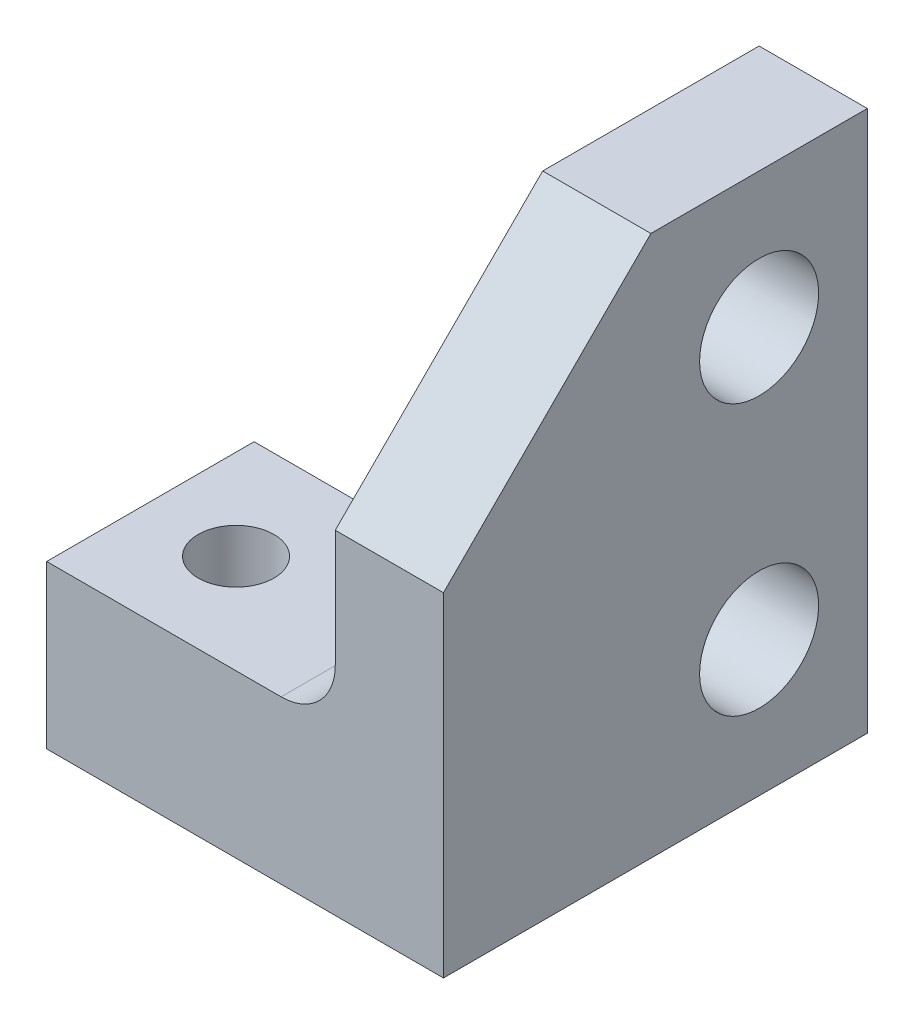
ISO-10303-21;
HEADER;
FILE_DESCRIPTION(('STEP AP214'),'2;1');
FILE_NAME('part.step','',(''),(''),'','','');
FILE_SCHEMA(('AUTOMOTIVE_DESIGN { 1 0 10303 214 1 1 1 1 }'));
ENDSEC;
DATA;
#1=APPLICATION_CONTEXT('core data for automotive mechanical design processes');
#2=APPLICATION_PROTOCOL_DEFINITION('international standard','automotive_design',2000,#1);
#3=PRODUCT_CONTEXT('',#1,'mechanical');
#4=PRODUCT('Part','Part','',(#3));
#5=PRODUCT_RELATED_PRODUCT_CATEGORY('part','',(#4));
#6=PRODUCT_DEFINITION_FORMATION('','',#4);
#7=PRODUCT_DEFINITION_CONTEXT('part definition',#1,'design');
#8=PRODUCT_DEFINITION('design','',#6,#7);
#9=PRODUCT_DEFINITION_SHAPE('','',#8);
#10=(LENGTH_UNIT() NAMED_UNIT(*) SI_UNIT(.MILLI.,.METRE.));
#11=(NAMED_UNIT(*) PLANE_ANGLE_UNIT() SI_UNIT($,.RADIAN.));
#12=(NAMED_UNIT(*) SI_UNIT($,.STERADIAN.) SOLID_ANGLE_UNIT());
#13=UNCERTAINTY_MEASURE_WITH_UNIT(LENGTH_MEASURE(1.E-05),#10,'distance_accuracy_value','');
#14=(GEOMETRIC_REPRESENTATION_CONTEXT(3) GLOBAL_UNCERTAINTY_ASSIGNED_CONTEXT((#13)) GLOBAL_UNIT_ASSIGNED_CONTEXT((#10,
#11,#12)) REPRESENTATION_CONTEXT('',''));
#15=CARTESIAN_POINT('',(0.,0.,0.));
#16=DIRECTION('',(0.,0.,1.));
#17=DIRECTION('',(1.,0.,0.));
#18=AXIS2_PLACEMENT_3D('',#15,#16,#17);
#19=CARTESIAN_POINT('',(-21.,-15.,23.5));
#20=DIRECTION('',(1.,0.,0.));
#21=DIRECTION('',(0.,0.,1.));
#22=AXIS2_PLACEMENT_3D('',#19,#20,#21);
#23=PLANE('',#22);
#24=DIRECTION('',(0.,1.,0.));
#25=VECTOR('',#24,1.);
#26=CARTESIAN_POINT('',(-21.,-15.,12.));
#27=LINE('',#26,#25);
#28=CARTESIAN_POINT('',(-21.,-15.,12.));
#29=VERTEX_POINT('',#28);
#30=CARTESIAN_POINT('',(-21.,-6.,12.));
#31=VERTEX_POINT('',#30);
#32=EDGE_CURVE('E173',#29,#31,#27,.T.);
#33=ORIENTED_EDGE('',*,*,#32,.F.);
#34=DIRECTION('',(0.,0.,-1.));
#35=VECTOR('',#34,1.);
#36=CARTESIAN_POINT('',(-21.,-15.,23.5));
#37=LINE('',#36,#35);
#38=CARTESIAN_POINT('',(-21.,-15.,23.5));
#39=VERTEX_POINT('',#38);
#40=EDGE_CURVE('E136',#39,#29,#37,.T.);
#41=ORIENTED_EDGE('',*,*,#40,.F.);
#42=DIRECTION('',(0.,1.,0.));
#43=VECTOR('',#42,1.);
#44=CARTESIAN_POINT('',(-21.,-15.,23.5));
#45=LINE('',#44,#43);
#46=CARTESIAN_POINT('',(-21.,-6.,23.5));
#47=VERTEX_POINT('',#46);
#48=EDGE_CURVE('E180',#39,#47,#45,.T.);
#49=ORIENTED_EDGE('',*,*,#48,.T.);
#50=DIRECTION('',(0.,0.,1.));
#51=VECTOR('',#50,1.);
#52=CARTESIAN_POINT('',(-21.,-6.,0.));
#53=LINE('',#52,#51);
#54=EDGE_CURVE('E157',#31,#47,#53,.T.);
#55=ORIENTED_EDGE('',*,*,#54,.F.);
#56=EDGE_LOOP('',(#33,#41,#49,#55));
#57=FACE_BOUND('',#56,.T.);
#58=ADVANCED_FACE('F36',(#57),#23,.F.);
#59=CARTESIAN_POINT('',(1.00000000000001,15.,23.5));
#60=DIRECTION('',(0.,-1.,0.));
#61=DIRECTION('',(0.,0.,-1.));
#62=AXIS2_PLACEMENT_3D('',#59,#60,#61);
#63=PLANE('',#62);
#64=DIRECTION('',(0.,0.,-1.));
#65=VECTOR('',#64,1.);
#66=CARTESIAN_POINT('',(1.00000000000001,15.,23.5));
#67=LINE('',#66,#65);
#68=CARTESIAN_POINT('',(1.00000000000001,15.,12.));
#69=VERTEX_POINT('',#68);
#70=CARTESIAN_POINT('',(1.,15.,0.));
#71=VERTEX_POINT('',#70);
#72=EDGE_CURVE('E122',#69,#71,#67,.T.);
#73=ORIENTED_EDGE('',*,*,#72,.T.);
#74=DIRECTION('',(1.,0.,0.));
#75=VECTOR('',#74,1.);
#76=CARTESIAN_POINT('',(1.,15.,0.));
#77=LINE('',#76,#75);
#78=CARTESIAN_POINT('',(-5.,15.,0.));
#79=VERTEX_POINT('',#78);
#80=EDGE_CURVE('E176',#79,#71,#77,.T.);
#81=ORIENTED_EDGE('',*,*,#80,.F.);
#82=DIRECTION('',(0.,0.,1.));
#83=VECTOR('',#82,1.);
#84=CARTESIAN_POINT('',(-5.,15.,0.));
#85=LINE('',#84,#83);
#86=CARTESIAN_POINT('',(-5.,15.,12.));
#87=VERTEX_POINT('',#86);
#88=EDGE_CURVE('E124',#79,#87,#85,.T.);
#89=ORIENTED_EDGE('',*,*,#88,.T.);
#90=DIRECTION('',(1.,0.,0.));
#91=VECTOR('',#90,1.);
#92=CARTESIAN_POINT('',(-21.,15.,12.));
#93=LINE('',#92,#91);
#94=EDGE_CURVE('E109',#87,#69,#93,.T.);
#95=ORIENTED_EDGE('',*,*,#94,.T.);
#96=EDGE_LOOP('',(#73,#81,#89,#95));
#97=FACE_BOUND('',#96,.T.);
#98=ADVANCED_FACE('F120',(#97),#63,.F.);
#99=CARTESIAN_POINT('',(1.00000000000001,-15.,23.5));
#100=DIRECTION('',(-1.,0.,0.));
#101=DIRECTION('',(0.,0.,-1.));
#102=AXIS2_PLACEMENT_3D('',#99,#100,#101);
#103=PLANE('',#102);
#104=CARTESIAN_POINT('',(1.00000000000001,7.5,6.));
#105=DIRECTION('',(-1.,0.,0.));
#106=DIRECTION('',(0.,0.,1.));
#107=AXIS2_PLACEMENT_3D('',#104,#105,#106);
#108=CIRCLE('',#107,3.29999999999999);
#109=CARTESIAN_POINT('',(1.00000000000001,7.5,9.29999999999998));
#110=VERTEX_POINT('',#109);
#111=EDGE_CURVE('E147',#110,#110,#108,.T.);
#112=ORIENTED_EDGE('',*,*,#111,.T.);
#113=EDGE_LOOP('',(#112));
#114=FACE_BOUND('',#113,.T.);
#115=CARTESIAN_POINT('',(1.00000000000001,-7.5,6.));
#116=DIRECTION('',(-1.,0.,0.));
#117=DIRECTION('',(0.,0.,1.));
#118=AXIS2_PLACEMENT_3D('',#115,#116,#117);
#119=CIRCLE('',#118,3.29999999999999);
#120=CARTESIAN_POINT('',(1.00000000000001,-7.5,9.29999999999998));
#121=VERTEX_POINT('',#120);
#122=EDGE_CURVE('E144',#121,#121,#119,.T.);
#123=ORIENTED_EDGE('',*,*,#122,.T.);
#124=EDGE_LOOP('',(#123));
#125=FACE_BOUND('',#124,.T.);
#126=DIRECTION('',(0.,-1.,0.));
#127=VECTOR('',#126,1.);
#128=CARTESIAN_POINT('',(1.00000000000001,-15.,23.5));
#129=LINE('',#128,#127);
#130=CARTESIAN_POINT('',(1.00000000000001,3.5,23.5));
#131=VERTEX_POINT('',#130);
#132=CARTESIAN_POINT('',(1.00000000000001,-15.,23.5));
#133=VERTEX_POINT('',#132);
#134=EDGE_CURVE('E183',#131,#133,#129,.T.);
#135=ORIENTED_EDGE('',*,*,#134,.T.);
#136=DIRECTION('',(0.,0.,-1.));
#137=VECTOR('',#136,1.);
#138=CARTESIAN_POINT('',(1.00000000000001,-15.,23.5));
#139=LINE('',#138,#137);
#140=CARTESIAN_POINT('',(1.,-15.,0.));
#141=VERTEX_POINT('',#140);
#142=EDGE_CURVE('E132',#133,#141,#139,.T.);
#143=ORIENTED_EDGE('',*,*,#142,.T.);
#144=DIRECTION('',(0.,-1.,0.));
#145=VECTOR('',#144,1.);
#146=CARTESIAN_POINT('',(1.,-15.,0.));
#147=LINE('',#146,#145);
#148=EDGE_CURVE('E129',#71,#141,#147,.T.);
#149=ORIENTED_EDGE('',*,*,#148,.F.);
#150=ORIENTED_EDGE('',*,*,#72,.F.);
#151=DIRECTION('',(0.,-0.707106781186548,0.707106781186548));
#152=VECTOR('',#151,1.);
#153=CARTESIAN_POINT('',(1.00000000000001,15.,12.));
#154=LINE('',#153,#152);
#155=EDGE_CURVE('E106',#69,#131,#154,.T.);
#156=ORIENTED_EDGE('',*,*,#155,.T.);
#157=EDGE_LOOP('',(#135,#143,#149,#150,#156));
#158=FACE_BOUND('',#157,.T.);
#159=ADVANCED_FACE('F126',(#114,#125,#158),#103,.F.);
#160=CARTESIAN_POINT('',(1.00000000000001,-15.,23.5));
#161=DIRECTION('',(0.,1.,0.));
#162=DIRECTION('',(0.,0.,1.));
#163=AXIS2_PLACEMENT_3D('',#160,#161,#162);
#164=PLANE('',#163);
#165=CARTESIAN_POINT('',(-16.,-15.,18.));
#166=DIRECTION('',(0.,1.,0.));
#167=DIRECTION('',(0.,0.,-1.));
#168=AXIS2_PLACEMENT_3D('',#165,#166,#167);
#169=CIRCLE('',#168,2.09999999999999);
#170=CARTESIAN_POINT('',(-16.,-15.,15.9));
#171=VERTEX_POINT('',#170);
#172=EDGE_CURVE('E303',#171,#171,#169,.T.);
#173=ORIENTED_EDGE('',*,*,#172,.T.);
#174=EDGE_LOOP('',(#173));
#175=FACE_BOUND('',#174,.T.);
#176=DIRECTION('',(0.,0.,1.));
#177=VECTOR('',#176,1.);
#178=CARTESIAN_POINT('',(-5.,-15.,0.));
#179=LINE('',#178,#177);
#180=CARTESIAN_POINT('',(-5.,-15.,0.));
#181=VERTEX_POINT('',#180);
#182=CARTESIAN_POINT('',(-5.,-15.,12.));
#183=VERTEX_POINT('',#182);
#184=EDGE_CURVE('E166',#181,#183,#179,.T.);
#185=ORIENTED_EDGE('',*,*,#184,.F.);
#186=DIRECTION('',(-1.,0.,0.));
#187=VECTOR('',#186,1.);
#188=CARTESIAN_POINT('',(1.,-15.,0.));
#189=LINE('',#188,#187);
#190=EDGE_CURVE('E184',#141,#181,#189,.T.);
#191=ORIENTED_EDGE('',*,*,#190,.F.);
#192=ORIENTED_EDGE('',*,*,#142,.F.);
#193=DIRECTION('',(-1.,0.,0.));
#194=VECTOR('',#193,1.);
#195=CARTESIAN_POINT('',(1.00000000000001,-15.,23.5));
#196=LINE('',#195,#194);
#197=EDGE_CURVE('E186',#133,#39,#196,.T.);
#198=ORIENTED_EDGE('',*,*,#197,.T.);
#199=ORIENTED_EDGE('',*,*,#40,.T.);
#200=DIRECTION('',(-1.,0.,0.));
#201=VECTOR('',#200,1.);
#202=CARTESIAN_POINT('',(-21.,-15.,12.));
#203=LINE('',#202,#201);
#204=EDGE_CURVE('E169',#183,#29,#203,.T.);
#205=ORIENTED_EDGE('',*,*,#204,.F.);
#206=EDGE_LOOP('',(#185,#191,#192,#198,#199,#205));
#207=FACE_BOUND('',#206,.T.);
#208=ADVANCED_FACE('F197',(#175,#207),#164,.F.);
#209=CARTESIAN_POINT('',(-9.99999999999999,0.,23.5));
#210=DIRECTION('',(0.,0.,-1.));
#211=DIRECTION('',(1.,0.,0.));
#212=AXIS2_PLACEMENT_3D('',#209,#210,#211);
#213=PLANE('',#212);
#214=DIRECTION('',(0.,-1.,0.));
#215=VECTOR('',#214,1.);
#216=CARTESIAN_POINT('',(-4.99999999999999,-6.,23.5));
#217=LINE('',#216,#215);
#218=CARTESIAN_POINT('',(-4.99999999999999,3.49999999999999,23.5));
#219=VERTEX_POINT('',#218);
#220=CARTESIAN_POINT('',(-4.99999999999999,-3.,23.5));
#221=VERTEX_POINT('',#220);
#222=EDGE_CURVE('E143',#219,#221,#217,.T.);
#223=ORIENTED_EDGE('',*,*,#222,.T.);
#224=CARTESIAN_POINT('',(-7.99999999999999,-3.,23.5));
#225=DIRECTION('',(0.,0.,1.));
#226=DIRECTION('',(1.,0.,0.));
#227=AXIS2_PLACEMENT_3D('',#224,#225,#226);
#228=CIRCLE('',#227,3.);
#229=CARTESIAN_POINT('',(-7.99999999999999,-6.,23.5));
#230=VERTEX_POINT('',#229);
#231=EDGE_CURVE('E44',#230,#221,#228,.T.);
#232=ORIENTED_EDGE('',*,*,#231,.F.);
#233=DIRECTION('',(-1.,0.,0.));
#234=VECTOR('',#233,1.);
#235=CARTESIAN_POINT('',(-21.,-6.,23.5));
#236=LINE('',#235,#234);
#237=EDGE_CURVE('E155',#230,#47,#236,.T.);
#238=ORIENTED_EDGE('',*,*,#237,.T.);
#239=ORIENTED_EDGE('',*,*,#48,.F.);
#240=ORIENTED_EDGE('',*,*,#197,.F.);
#241=ORIENTED_EDGE('',*,*,#134,.F.);
#242=DIRECTION('',(1.,0.,0.));
#243=VECTOR('',#242,1.);
#244=CARTESIAN_POINT('',(-21.,3.5,23.5));
#245=LINE('',#244,#243);
#246=EDGE_CURVE('E112',#219,#131,#245,.T.);
#247=ORIENTED_EDGE('',*,*,#246,.F.);
#248=EDGE_LOOP('',(#223,#232,#238,#239,#240,#241,#247));
#249=FACE_BOUND('',#248,.T.);
#250=ADVANCED_FACE('F154',(#249),#213,.F.);
#251=CARTESIAN_POINT('',(-9.99999999999999,0.,0.));
#252=DIRECTION('',(0.,0.,-1.));
#253=DIRECTION('',(1.,0.,0.));
#254=AXIS2_PLACEMENT_3D('',#251,#252,#253);
#255=PLANE('',#254);
#256=DIRECTION('',(0.,1.,0.));
#257=VECTOR('',#256,1.);
#258=CARTESIAN_POINT('',(-5.,-15.,0.));
#259=LINE('',#258,#257);
#260=EDGE_CURVE('E171',#181,#79,#259,.T.);
#261=ORIENTED_EDGE('',*,*,#260,.T.);
#262=ORIENTED_EDGE('',*,*,#80,.T.);
#263=ORIENTED_EDGE('',*,*,#148,.T.);
#264=ORIENTED_EDGE('',*,*,#190,.T.);
#265=EDGE_LOOP('',(#261,#262,#263,#264));
#266=FACE_BOUND('',#265,.T.);
#267=ADVANCED_FACE('F207',(#266),#255,.T.);
#268=CARTESIAN_POINT('',(-21.,-15.,12.));
#269=DIRECTION('',(0.,0.,1.));
#270=DIRECTION('',(-1.,0.,0.));
#271=AXIS2_PLACEMENT_3D('',#268,#269,#270);
#272=PLANE('',#271);
#273=DIRECTION('',(0.,1.,0.));
#274=VECTOR('',#273,1.);
#275=CARTESIAN_POINT('',(-5.,-15.,12.));
#276=LINE('',#275,#274);
#277=CARTESIAN_POINT('',(-5.,-3.,12.));
#278=VERTEX_POINT('',#277);
#279=EDGE_CURVE('E177',#183,#278,#276,.T.);
#280=ORIENTED_EDGE('',*,*,#279,.F.);
#281=ORIENTED_EDGE('',*,*,#204,.T.);
#282=ORIENTED_EDGE('',*,*,#32,.T.);
#283=DIRECTION('',(-1.,0.,0.));
#284=VECTOR('',#283,1.);
#285=CARTESIAN_POINT('',(-21.,-6.,12.));
#286=LINE('',#285,#284);
#287=CARTESIAN_POINT('',(-8.,-6.,12.));
#288=VERTEX_POINT('',#287);
#289=EDGE_CURVE('E164',#288,#31,#286,.T.);
#290=ORIENTED_EDGE('',*,*,#289,.F.);
#291=CARTESIAN_POINT('',(-8.,-3.,12.));
#292=DIRECTION('',(0.,0.,-1.));
#293=DIRECTION('',(-1.,0.,0.));
#294=AXIS2_PLACEMENT_3D('',#291,#292,#293);
#295=CIRCLE('',#294,3.);
#296=EDGE_CURVE('E11',#278,#288,#295,.T.);
#297=ORIENTED_EDGE('',*,*,#296,.F.);
#298=EDGE_LOOP('',(#280,#281,#282,#290,#297));
#299=FACE_BOUND('',#298,.T.);
#300=ADVANCED_FACE('F204',(#299),#272,.F.);
#301=CARTESIAN_POINT('',(-5.,-15.,0.));
#302=DIRECTION('',(1.,0.,0.));
#303=DIRECTION('',(0.,0.,1.));
#304=AXIS2_PLACEMENT_3D('',#301,#302,#303);
#305=PLANE('',#304);
#306=CARTESIAN_POINT('',(-5.,7.5,6.));
#307=DIRECTION('',(-1.,0.,0.));
#308=DIRECTION('',(0.,0.,1.));
#309=AXIS2_PLACEMENT_3D('',#306,#307,#308);
#310=CIRCLE('',#309,3.29999999999999);
#311=CARTESIAN_POINT('',(-5.,7.5,9.29999999999999));
#312=VERTEX_POINT('',#311);
#313=EDGE_CURVE('E145',#312,#312,#310,.T.);
#314=ORIENTED_EDGE('',*,*,#313,.F.);
#315=EDGE_LOOP('',(#314));
#316=FACE_BOUND('',#315,.T.);
#317=CARTESIAN_POINT('',(-5.,-7.5,6.));
#318=DIRECTION('',(-1.,0.,0.));
#319=DIRECTION('',(0.,0.,1.));
#320=AXIS2_PLACEMENT_3D('',#317,#318,#319);
#321=CIRCLE('',#320,3.29999999999999);
#322=CARTESIAN_POINT('',(-5.,-7.5,9.29999999999999));
#323=VERTEX_POINT('',#322);
#324=EDGE_CURVE('E140',#323,#323,#321,.T.);
#325=ORIENTED_EDGE('',*,*,#324,.F.);
#326=EDGE_LOOP('',(#325));
#327=FACE_BOUND('',#326,.T.);
#328=ORIENTED_EDGE('',*,*,#222,.F.);
#329=DIRECTION('',(0.,-0.707106781186548,0.707106781186548));
#330=VECTOR('',#329,1.);
#331=CARTESIAN_POINT('',(-4.99999999999999,5.99999999999999,21.));
#332=LINE('',#331,#330);
#333=EDGE_CURVE('E131',#87,#219,#332,.T.);
#334=ORIENTED_EDGE('',*,*,#333,.F.);
#335=ORIENTED_EDGE('',*,*,#88,.F.);
#336=ORIENTED_EDGE('',*,*,#260,.F.);
#337=ORIENTED_EDGE('',*,*,#184,.T.);
#338=ORIENTED_EDGE('',*,*,#279,.T.);
#339=DIRECTION('',(0.,0.,1.));
#340=VECTOR('',#339,1.);
#341=CARTESIAN_POINT('',(-5.,-3.,12.));
#342=LINE('',#341,#340);
#343=EDGE_CURVE('E50',#221,#278,#342,.F.);
#344=ORIENTED_EDGE('',*,*,#343,.F.);
#345=EDGE_LOOP('',(#328,#334,#335,#336,#337,#338,#344));
#346=FACE_BOUND('',#345,.T.);
#347=ADVANCED_FACE('F205',(#316,#327,#346),#305,.F.);
#348=CARTESIAN_POINT('',(-21.,-6.,0.));
#349=DIRECTION('',(0.,-1.,0.));
#350=DIRECTION('',(-1.,0.,0.));
#351=AXIS2_PLACEMENT_3D('',#348,#349,#350);
#352=PLANE('',#351);
#353=CARTESIAN_POINT('',(-16.,-6.,18.));
#354=DIRECTION('',(0.,1.,0.));
#355=DIRECTION('',(-1.,0.,0.));
#356=AXIS2_PLACEMENT_3D('',#353,#354,#355);
#357=CIRCLE('',#356,2.09999999999999);
#358=CARTESIAN_POINT('',(-18.1,-6.,18.));
#359=VERTEX_POINT('',#358);
#360=EDGE_CURVE('E305',#359,#359,#357,.T.);
#361=ORIENTED_EDGE('',*,*,#360,.F.);
#362=EDGE_LOOP('',(#361));
#363=FACE_BOUND('',#362,.T.);
#364=ORIENTED_EDGE('',*,*,#289,.T.);
#365=ORIENTED_EDGE('',*,*,#54,.T.);
#366=ORIENTED_EDGE('',*,*,#237,.F.);
#367=DIRECTION('',(0.,0.,1.));
#368=VECTOR('',#367,1.);
#369=CARTESIAN_POINT('',(-7.99999999999999,-6.,23.5));
#370=LINE('',#369,#368);
#371=EDGE_CURVE('E134',#288,#230,#370,.T.);
#372=ORIENTED_EDGE('',*,*,#371,.F.);
#373=EDGE_LOOP('',(#364,#365,#366,#372));
#374=FACE_BOUND('',#373,.T.);
#375=ADVANCED_FACE('F209',(#363,#374),#352,.F.);
#376=CARTESIAN_POINT('',(1.,-7.5,6.));
#377=DIRECTION('',(1.,0.,0.));
#378=DIRECTION('',(0.,0.,1.));
#379=AXIS2_PLACEMENT_3D('',#376,#377,#378);
#380=CYLINDRICAL_SURFACE('',#379,3.29999999999999);
#381=ORIENTED_EDGE('',*,*,#122,.F.);
#382=EDGE_LOOP('',(#381));
#383=FACE_BOUND('',#382,.T.);
#384=ORIENTED_EDGE('',*,*,#324,.T.);
#385=EDGE_LOOP('',(#384));
#386=FACE_BOUND('',#385,.T.);
#387=ADVANCED_FACE('F211',(#383,#386),#380,.F.);
#388=CARTESIAN_POINT('',(1.,7.5,6.));
#389=DIRECTION('',(1.,0.,0.));
#390=DIRECTION('',(0.,0.,1.));
#391=AXIS2_PLACEMENT_3D('',#388,#389,#390);
#392=CYLINDRICAL_SURFACE('',#391,3.29999999999999);
#393=ORIENTED_EDGE('',*,*,#111,.F.);
#394=EDGE_LOOP('',(#393));
#395=FACE_BOUND('',#394,.T.);
#396=ORIENTED_EDGE('',*,*,#313,.T.);
#397=EDGE_LOOP('',(#396));
#398=FACE_BOUND('',#397,.T.);
#399=ADVANCED_FACE('F218',(#395,#398),#392,.F.);
#400=CARTESIAN_POINT('',(-16.,-15.,18.));
#401=DIRECTION('',(0.,-1.,0.));
#402=DIRECTION('',(0.,0.,-1.));
#403=AXIS2_PLACEMENT_3D('',#400,#401,#402);
#404=CYLINDRICAL_SURFACE('',#403,2.09999999999999);
#405=ORIENTED_EDGE('',*,*,#172,.F.);
#406=EDGE_LOOP('',(#405));
#407=FACE_BOUND('',#406,.T.);
#408=ORIENTED_EDGE('',*,*,#360,.T.);
#409=EDGE_LOOP('',(#408));
#410=FACE_BOUND('',#409,.T.);
#411=ADVANCED_FACE('F269',(#407,#410),#404,.F.);
#412=CARTESIAN_POINT('',(-21.,15.,12.));
#413=DIRECTION('',(0.,-0.707106781186548,-0.707106781186548));
#414=DIRECTION('',(0.,0.707106781186548,-0.707106781186548));
#415=AXIS2_PLACEMENT_3D('',#412,#413,#414);
#416=PLANE('',#415);
#417=ORIENTED_EDGE('',*,*,#94,.F.);
#418=ORIENTED_EDGE('',*,*,#333,.T.);
#419=ORIENTED_EDGE('',*,*,#246,.T.);
#420=ORIENTED_EDGE('',*,*,#155,.F.);
#421=EDGE_LOOP('',(#417,#418,#419,#420));
#422=FACE_BOUND('',#421,.T.);
#423=ADVANCED_FACE('F108',(#422),#416,.F.);
#424=CARTESIAN_POINT('',(-8.,-3.,0.));
#425=DIRECTION('',(0.,0.,-1.));
#426=DIRECTION('',(1.,0.,0.));
#427=AXIS2_PLACEMENT_3D('',#424,#425,#426);
#428=CYLINDRICAL_SURFACE('',#427,3.);
#429=ORIENTED_EDGE('',*,*,#296,.T.);
#430=ORIENTED_EDGE('',*,*,#371,.T.);
#431=ORIENTED_EDGE('',*,*,#231,.T.);
#432=ORIENTED_EDGE('',*,*,#343,.T.);
#433=EDGE_LOOP('',(#429,#430,#431,#432));
#434=FACE_BOUND('',#433,.T.);
#435=ADVANCED_FACE('F38',(#434),#428,.F.);
#436=CLOSED_SHELL('',(#58,#98,#159,#208,#250,#267,#300,#347,#375,#387,#399,#411,#423,#435));
#437=MANIFOLD_SOLID_BREP('B2',#436);
#438=ADVANCED_BREP_SHAPE_REPRESENTATION('',(#18,#437),#14);
#439=SHAPE_DEFINITION_REPRESENTATION(#9,#438);
ENDSEC;
END-ISO-10303-21;
